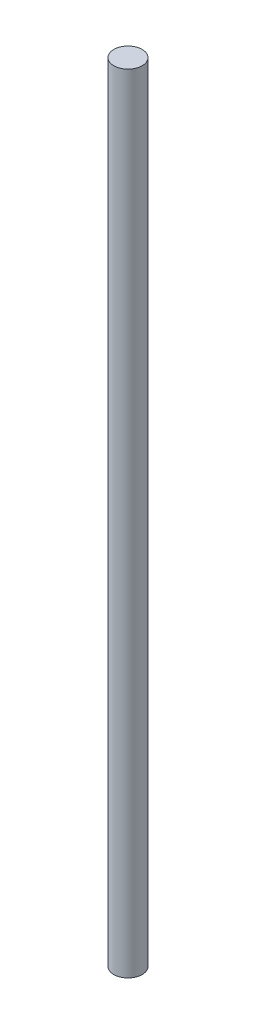
ISO-10303-21;
HEADER;
FILE_DESCRIPTION(('STEP AP214'),'2;1');
FILE_NAME('part.step','',(''),(''),'','','');
FILE_SCHEMA(('AUTOMOTIVE_DESIGN { 1 0 10303 214 1 1 1 1 }'));
ENDSEC;
DATA;
#1=APPLICATION_CONTEXT('core data for automotive mechanical design processes');
#2=APPLICATION_PROTOCOL_DEFINITION('international standard','automotive_design',2000,#1);
#3=PRODUCT_CONTEXT('',#1,'mechanical');
#4=PRODUCT('Part','Part','',(#3));
#5=PRODUCT_RELATED_PRODUCT_CATEGORY('part','',(#4));
#6=PRODUCT_DEFINITION_FORMATION('','',#4);
#7=PRODUCT_DEFINITION_CONTEXT('part definition',#1,'design');
#8=PRODUCT_DEFINITION('design','',#6,#7);
#9=PRODUCT_DEFINITION_SHAPE('','',#8);
#10=(LENGTH_UNIT() NAMED_UNIT(*) SI_UNIT(.MILLI.,.METRE.));
#11=(NAMED_UNIT(*) PLANE_ANGLE_UNIT() SI_UNIT($,.RADIAN.));
#12=(NAMED_UNIT(*) SI_UNIT($,.STERADIAN.) SOLID_ANGLE_UNIT());
#13=UNCERTAINTY_MEASURE_WITH_UNIT(LENGTH_MEASURE(1.E-05),#10,'distance_accuracy_value','');
#14=(GEOMETRIC_REPRESENTATION_CONTEXT(3) GLOBAL_UNCERTAINTY_ASSIGNED_CONTEXT((#13)) GLOBAL_UNIT_ASSIGNED_CONTEXT((#10,
#11,#12)) REPRESENTATION_CONTEXT('',''));
#15=CARTESIAN_POINT('',(0.,0.,0.));
#16=DIRECTION('',(0.,0.,1.));
#17=DIRECTION('',(1.,0.,0.));
#18=AXIS2_PLACEMENT_3D('',#15,#16,#17);
#19=CARTESIAN_POINT('',(0.,250.,0.));
#20=DIRECTION('',(0.,-1.,0.));
#21=DIRECTION('',(0.,0.,-1.));
#22=AXIS2_PLACEMENT_3D('',#19,#20,#21);
#23=CYLINDRICAL_SURFACE('',#22,9.);
#24=CARTESIAN_POINT('',(0.,250.,0.));
#25=DIRECTION('',(0.,1.,0.));
#26=DIRECTION('',(0.,0.,1.));
#27=AXIS2_PLACEMENT_3D('',#24,#25,#26);
#28=CIRCLE('',#27,9.);
#29=CARTESIAN_POINT('',(0.,250.,9.));
#30=VERTEX_POINT('',#29);
#31=EDGE_CURVE('E10',#30,#30,#28,.T.);
#32=ORIENTED_EDGE('',*,*,#31,.F.);
#33=EDGE_LOOP('',(#32));
#34=FACE_BOUND('',#33,.T.);
#35=CARTESIAN_POINT('',(0.,-250.,0.));
#36=DIRECTION('',(0.,1.,0.));
#37=DIRECTION('',(0.,0.,1.));
#38=AXIS2_PLACEMENT_3D('',#35,#36,#37);
#39=CIRCLE('',#38,9.);
#40=CARTESIAN_POINT('',(0.,-250.,9.));
#41=VERTEX_POINT('',#40);
#42=EDGE_CURVE('E40',#41,#41,#39,.T.);
#43=ORIENTED_EDGE('',*,*,#42,.T.);
#44=EDGE_LOOP('',(#43));
#45=FACE_BOUND('',#44,.T.);
#46=ADVANCED_FACE('F37',(#34,#45),#23,.T.);
#47=CARTESIAN_POINT('',(0.,250.,0.));
#48=DIRECTION('',(0.,1.,0.));
#49=DIRECTION('',(0.,0.,1.));
#50=AXIS2_PLACEMENT_3D('',#47,#48,#49);
#51=PLANE('',#50);
#52=ORIENTED_EDGE('',*,*,#31,.T.);
#53=EDGE_LOOP('',(#52));
#54=FACE_BOUND('',#53,.T.);
#55=ADVANCED_FACE('F54',(#54),#51,.T.);
#56=CARTESIAN_POINT('',(0.,-250.,0.));
#57=DIRECTION('',(0.,1.,0.));
#58=DIRECTION('',(0.,0.,1.));
#59=AXIS2_PLACEMENT_3D('',#56,#57,#58);
#60=PLANE('',#59);
#61=ORIENTED_EDGE('',*,*,#42,.F.);
#62=EDGE_LOOP('',(#61));
#63=FACE_BOUND('',#62,.T.);
#64=ADVANCED_FACE('F52',(#63),#60,.F.);
#65=CLOSED_SHELL('',(#46,#55,#64));
#66=MANIFOLD_SOLID_BREP('B2',#65);
#67=ADVANCED_BREP_SHAPE_REPRESENTATION('',(#18,#66),#14);
#68=SHAPE_DEFINITION_REPRESENTATION(#9,#67);
ENDSEC;
END-ISO-10303-21;
